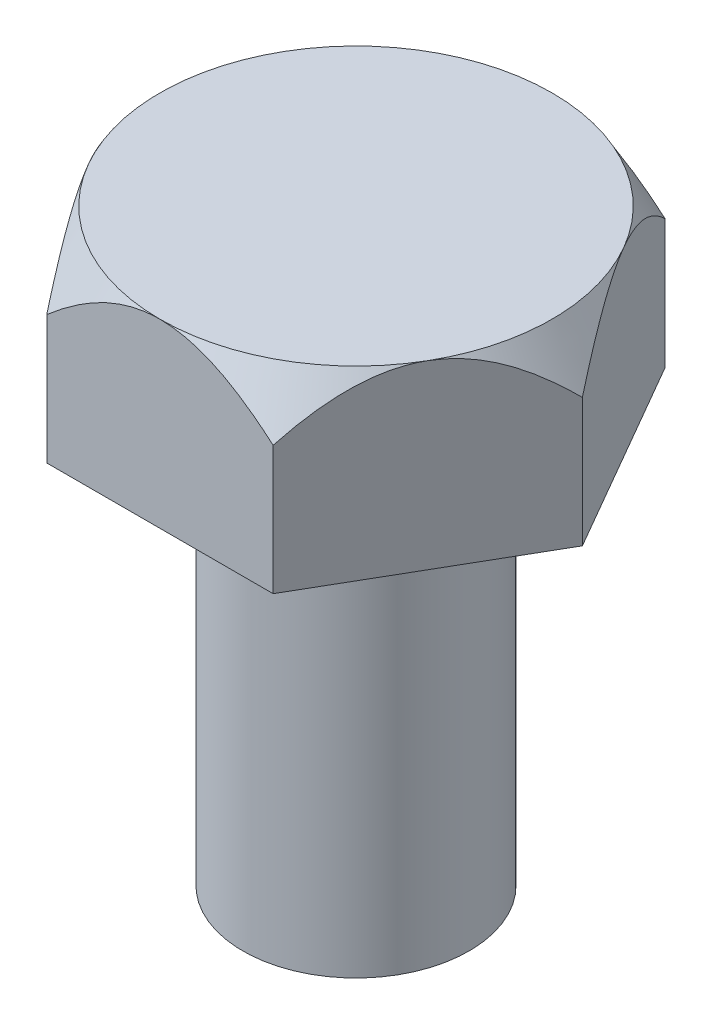
ISO-10303-21;
HEADER;
FILE_DESCRIPTION(('STEP AP214'),'2;1');
FILE_NAME('part.step','',(''),(''),'','','');
FILE_SCHEMA(('AUTOMOTIVE_DESIGN { 1 0 10303 214 1 1 1 1 }'));
ENDSEC;
DATA;
#1=APPLICATION_CONTEXT('core data for automotive mechanical design processes');
#2=APPLICATION_PROTOCOL_DEFINITION('international standard','automotive_design',2000,#1);
#3=PRODUCT_CONTEXT('',#1,'mechanical');
#4=PRODUCT('Part','Part','',(#3));
#5=PRODUCT_RELATED_PRODUCT_CATEGORY('part','',(#4));
#6=PRODUCT_DEFINITION_FORMATION('','',#4);
#7=PRODUCT_DEFINITION_CONTEXT('part definition',#1,'design');
#8=PRODUCT_DEFINITION('design','',#6,#7);
#9=PRODUCT_DEFINITION_SHAPE('','',#8);
#10=(LENGTH_UNIT() NAMED_UNIT(*) SI_UNIT(.MILLI.,.METRE.));
#11=(NAMED_UNIT(*) PLANE_ANGLE_UNIT() SI_UNIT($,.RADIAN.));
#12=(NAMED_UNIT(*) SI_UNIT($,.STERADIAN.) SOLID_ANGLE_UNIT());
#13=UNCERTAINTY_MEASURE_WITH_UNIT(LENGTH_MEASURE(1.E-05),#10,'distance_accuracy_value','');
#14=(GEOMETRIC_REPRESENTATION_CONTEXT(3) GLOBAL_UNCERTAINTY_ASSIGNED_CONTEXT((#13)) GLOBAL_UNIT_ASSIGNED_CONTEXT((#10,
#11,#12)) REPRESENTATION_CONTEXT('',''));
#15=CARTESIAN_POINT('',(0.,0.,0.));
#16=DIRECTION('',(0.,0.,1.));
#17=DIRECTION('',(1.,0.,0.));
#18=AXIS2_PLACEMENT_3D('',#15,#16,#17);
#19=CARTESIAN_POINT('',(2.50000000000005,2.,4.33012701892216));
#20=DIRECTION('',(-0.866025403784441,0.,-0.499999999999995));
#21=DIRECTION('',(-0.499999999999995,0.,0.866025403784442));
#22=AXIS2_PLACEMENT_3D('',#19,#20,#21);
#23=PLANE('',#22);
#24=CARTESIAN_POINT('',(2.49988452994621,0.839545955227598,4.33032701892216));
#25=CARTESIAN_POINT('',(2.52603245800554,0.884833991447394,4.28503747901075));
#26=CARTESIAN_POINT('',(2.55244128791382,0.929518035923133,4.23929604384116));
#27=CARTESIAN_POINT('',(2.60583817838497,1.01750976912944,4.14680991657893));
#28=CARTESIAN_POINT('',(2.63282640201025,1.06081706165426,4.10006494205393));
#29=CARTESIAN_POINT('',(2.71500179884512,1.18881585056256,3.95773297960379));
#30=CARTESIAN_POINT('',(2.77113436738581,1.27111911679774,3.86050851893198));
#31=CARTESIAN_POINT('',(2.88776924238884,1.42932238274939,3.65849098949228));
#32=CARTESIAN_POINT('',(2.94834697835078,1.50500200033683,3.5535672729987));
#33=CARTESIAN_POINT('',(3.07278408923163,1.64429961580708,3.33803587460598));
#34=CARTESIAN_POINT('',(3.13663580046347,1.70794428122144,3.22744146660223));
#35=CARTESIAN_POINT('',(3.2378366675211,1.79393750545759,3.05215642308838));
#36=CARTESIAN_POINT('',(3.27400113565673,1.82188687918375,2.98951772684876));
#37=CARTESIAN_POINT('',(3.34727729424076,1.87236847470195,2.86259969719775));
#38=CARTESIAN_POINT('',(3.38438905537677,1.89490029091747,2.79832024135182));
#39=CARTESIAN_POINT('',(3.45911696425962,1.93368543760243,2.66888770642335));
#40=CARTESIAN_POINT('',(3.49672679341896,1.9499870584244,2.60374557145538));
#41=CARTESIAN_POINT('',(3.57251251722487,1.97597375980844,2.47248084733516));
#42=CARTESIAN_POINT('',(3.6106883045947,1.98566007831629,2.40635844399167));
#43=CARTESIAN_POINT('',(3.68767936258864,1.99808653406365,2.27300601981768));
#44=CARTESIAN_POINT('',(3.72649728421043,2.00076182897186,2.20577140732451));
#45=CARTESIAN_POINT('',(3.80408749242931,1.99886400426914,2.07138122451956));
#46=CARTESIAN_POINT('',(3.84285977918336,1.99429090966185,2.00422565393592));
#47=CARTESIAN_POINT('',(3.92011612559996,1.97807202204519,1.87041373673523));
#48=CARTESIAN_POINT('',(3.9585993739899,1.96641085271009,1.80375879528356));
#49=CARTESIAN_POINT('',(4.03492590542164,1.93647663009405,1.67155736487828));
#50=CARTESIAN_POINT('',(4.07276878876885,1.91819959598438,1.60601156821601));
#51=CARTESIAN_POINT('',(4.20657897982356,1.84210445780605,1.37424551873874));
#52=CARTESIAN_POINT('',(4.30021121617737,1.76734971383784,1.21206972814764));
#53=CARTESIAN_POINT('',(4.43543249725157,1.63456913855986,0.977859599062575));
#54=CARTESIAN_POINT('',(4.47974586319208,1.58671256690894,0.901106597799212));
#55=CARTESIAN_POINT('',(4.56673669386177,1.485346588253,0.750434059286692));
#56=CARTESIAN_POINT('',(4.60941442616695,1.4318381112785,0.676514058582298));
#57=CARTESIAN_POINT('',(4.7127668261096,1.29425164004733,0.497502450797452));
#58=CARTESIAN_POINT('',(4.77256183449973,1.20754661318338,0.393934458226729));
#59=CARTESIAN_POINT('',(4.85978832952453,1.07256834333777,0.242853737077619));
#60=CARTESIAN_POINT('',(4.88829841155851,1.02702662505186,0.193472826466821));
#61=CARTESIAN_POINT('',(4.94467395600481,0.934395945980258,0.0958275191814639));
#62=CARTESIAN_POINT('',(4.97253955043799,0.887307306945606,0.0475628938400857));
#63=CARTESIAN_POINT('',(5.00011547005384,0.839545955227599,-0.000200000000000099));
#64=B_SPLINE_CURVE_WITH_KNOTS('',3,(#24,#25,#26,#27,#28,#29,#30,#31,#32,#33,#34,#35,#36,#37,#38,
#39,#40,#41,#42,#43,#44,#45,#46,#47,#48,#49,#50,#51,#52,#53,#54,#55,#56,#57,#58,#59,#60,#61,#62,
#63),.UNSPECIFIED.,.F.,.F.,(4,2,2,2,2,2,2,2,2,2,2,2,2,2,2,2,2,2,2,4),(0.,0.207530396012229,
0.41511998480407,0.832413361514788,1.26048832134564,1.68760332572676,1.92005107232724,
2.15251621533175,2.38314109470961,2.6137228045741,2.84642967265257,3.0791357380002,
3.31234842869416,3.54570167958106,4.14661318376483,4.44867935464676,4.75069589723914,
5.19343142055808,5.41233685043555,5.63119703392207),.UNSPECIFIED.);
#65=CARTESIAN_POINT('',(2.50000000000005,0.839745962155642,4.33012701892216));
#66=VERTEX_POINT('',#65);
#67=CARTESIAN_POINT('',(3.75000000000002,2.,2.16506350946108));
#68=VERTEX_POINT('',#67);
#69=EDGE_CURVE('E130',#66,#68,#64,.T.);
#70=ORIENTED_EDGE('',*,*,#69,.F.);
#71=DIRECTION('',(0.,-1.,0.));
#72=VECTOR('',#71,1.);
#73=CARTESIAN_POINT('',(2.50000000000005,2.,4.33012701892216));
#74=LINE('',#73,#72);
#75=CARTESIAN_POINT('',(2.50000000000005,-2.,4.33012701892216));
#76=VERTEX_POINT('',#75);
#77=EDGE_CURVE('E79',#66,#76,#74,.T.);
#78=ORIENTED_EDGE('',*,*,#77,.T.);
#79=DIRECTION('',(0.499999999999995,0.,-0.866025403784441));
#80=VECTOR('',#79,1.);
#81=CARTESIAN_POINT('',(2.50000000000005,-2.,4.33012701892216));
#82=LINE('',#81,#80);
#83=CARTESIAN_POINT('',(5.,-2.,0.));
#84=VERTEX_POINT('',#83);
#85=EDGE_CURVE('E137',#76,#84,#82,.T.);
#86=ORIENTED_EDGE('',*,*,#85,.T.);
#87=DIRECTION('',(0.,-1.,0.));
#88=VECTOR('',#87,1.);
#89=CARTESIAN_POINT('',(5.,2.,0.));
#90=LINE('',#89,#88);
#91=CARTESIAN_POINT('',(5.,0.839745962155641,0.));
#92=VERTEX_POINT('',#91);
#93=EDGE_CURVE('E153',#92,#84,#90,.T.);
#94=ORIENTED_EDGE('',*,*,#93,.F.);
#95=EDGE_CURVE('E138',#68,#92,#64,.T.);
#96=ORIENTED_EDGE('',*,*,#95,.F.);
#97=EDGE_LOOP('',(#70,#78,#86,#94,#96));
#98=FACE_BOUND('',#97,.T.);
#99=ADVANCED_FACE('F55',(#98),#23,.F.);
#100=CARTESIAN_POINT('',(5.,2.,0.));
#101=DIRECTION('',(-0.866025403784438,0.,0.500000000000001));
#102=DIRECTION('',(0.500000000000001,0.,0.866025403784438));
#103=AXIS2_PLACEMENT_3D('',#100,#101,#102);
#104=PLANE('',#103);
#105=CARTESIAN_POINT('',(5.00011547005384,0.839545955227598,0.000200000000000032));
#106=CARTESIAN_POINT('',(4.97396754199451,0.884833991447395,-0.0450895399114115));
#107=CARTESIAN_POINT('',(4.94755871208623,0.929518035923133,-0.0908309750810041));
#108=CARTESIAN_POINT('',(4.89416182161507,1.01750976912944,-0.183317102343229));
#109=CARTESIAN_POINT('',(4.8671735979898,1.06081706165426,-0.230062076868234));
#110=CARTESIAN_POINT('',(4.78499820115492,1.18881585056256,-0.372394039318373));
#111=CARTESIAN_POINT('',(4.72886563261424,1.27111911679774,-0.469618499990178));
#112=CARTESIAN_POINT('',(4.61223075761121,1.42932238274939,-0.671636029429878));
#113=CARTESIAN_POINT('',(4.55165302164927,1.50500200033683,-0.776559745923452));
#114=CARTESIAN_POINT('',(4.42721591076841,1.64429961580709,-0.992091144316173));
#115=CARTESIAN_POINT('',(4.36336419953658,1.70794428122145,-1.10268555231992));
#116=CARTESIAN_POINT('',(4.26216333247894,1.7939375054576,-1.27797059583377));
#117=CARTESIAN_POINT('',(4.22599886434331,1.82188687918376,-1.34060929207339));
#118=CARTESIAN_POINT('',(4.15272270575929,1.87236847470197,-1.4675273217244));
#119=CARTESIAN_POINT('',(4.11561094462327,1.89490029091748,-1.53180677757033));
#120=CARTESIAN_POINT('',(4.04088303574043,1.93368543760245,-1.6612393124988));
#121=CARTESIAN_POINT('',(4.00327320658108,1.94998705842442,-1.72638144746677));
#122=CARTESIAN_POINT('',(3.92748748277517,1.97597375980847,-1.85764617158699));
#123=CARTESIAN_POINT('',(3.88931169540534,1.98566007831632,-1.92376857493048));
#124=CARTESIAN_POINT('',(3.8123206374114,1.99808653406368,-2.05712099910447));
#125=CARTESIAN_POINT('',(3.77350271578961,2.00076182897189,-2.12435561159764));
#126=CARTESIAN_POINT('',(3.69591250757073,1.99886400426917,-2.25874579440259));
#127=CARTESIAN_POINT('',(3.65714022081668,1.99429090966188,-2.32590136498623));
#128=CARTESIAN_POINT('',(3.57988387440008,1.97807202204523,-2.45971328218692));
#129=CARTESIAN_POINT('',(3.54140062601014,1.96641085271012,-2.52636822363859));
#130=CARTESIAN_POINT('',(3.4650740945784,1.93647663009408,-2.65856965404387));
#131=CARTESIAN_POINT('',(3.42723121123119,1.91819959598441,-2.72411545070614));
#132=CARTESIAN_POINT('',(3.29342102017648,1.84210445780609,-2.9558815001834));
#133=CARTESIAN_POINT('',(3.19978878382266,1.76734971383789,-3.1180572907745));
#134=CARTESIAN_POINT('',(3.06456750274847,1.63456913855991,-3.35226741985956));
#135=CARTESIAN_POINT('',(3.02025413680795,1.58671256690899,-3.42902042112292));
#136=CARTESIAN_POINT('',(2.93326330613827,1.48534658825306,-3.57969295963544));
#137=CARTESIAN_POINT('',(2.89058557383309,1.43183811127856,-3.65361296033983));
#138=CARTESIAN_POINT('',(2.78723317389043,1.29425164004739,-3.83262456812469));
#139=CARTESIAN_POINT('',(2.72743816550029,1.20754661318342,-3.93619256069542));
#140=CARTESIAN_POINT('',(2.64021167047548,1.07256834333779,-4.08727328184455));
#141=CARTESIAN_POINT('',(2.6117015884415,1.02702662505189,-4.13665419245536));
#142=CARTESIAN_POINT('',(2.55532604399519,0.934395945980272,-4.23429949974072));
#143=CARTESIAN_POINT('',(2.527460449562,0.887307306945614,-4.28256412508211));
#144=CARTESIAN_POINT('',(2.49988452994615,0.839545955227599,-4.3303270189222));
#145=B_SPLINE_CURVE_WITH_KNOTS('',3,(#105,#106,#107,#108,#109,#110,#111,#112,#113,#114,#115,
#116,#117,#118,#119,#120,#121,#122,#123,#124,#125,#126,#127,#128,#129,#130,#131,#132,#133,#134,
#135,#136,#137,#138,#139,#140,#141,#142,#143,#144),.UNSPECIFIED.,.F.,.F.,(4,2,2,2,2,2,2,2,2,2,2,
2,2,2,2,2,2,2,2,4),(0.,0.207530396012229,0.41511998480407,0.832413361514788,1.26048832134564,
1.68760332572676,1.92005107232724,2.15251621533175,2.38314109470961,2.6137228045741,
2.84642967265257,3.0791357380002,3.31234842869416,3.54570167958106,4.14661318376482,
4.44867935464674,4.75069589723911,5.19343142055811,5.4123368504356,5.63119703392216),.UNSPECIFIED.);
#146=CARTESIAN_POINT('',(3.75000000000001,2.,-2.16506350946111));
#147=VERTEX_POINT('',#146);
#148=EDGE_CURVE('E144',#92,#147,#145,.T.);
#149=ORIENTED_EDGE('',*,*,#148,.F.);
#150=ORIENTED_EDGE('',*,*,#93,.T.);
#151=DIRECTION('',(-0.500000000000001,0.,-0.866025403784438));
#152=VECTOR('',#151,1.);
#153=CARTESIAN_POINT('',(5.,-2.,0.));
#154=LINE('',#153,#152);
#155=CARTESIAN_POINT('',(2.49999999999999,-2.,-4.3301270189222));
#156=VERTEX_POINT('',#155);
#157=EDGE_CURVE('E277',#84,#156,#154,.T.);
#158=ORIENTED_EDGE('',*,*,#157,.T.);
#159=DIRECTION('',(0.,-1.,0.));
#160=VECTOR('',#159,1.);
#161=CARTESIAN_POINT('',(2.49999999999999,2.,-4.3301270189222));
#162=LINE('',#161,#160);
#163=CARTESIAN_POINT('',(2.5,0.839745962155638,-4.3301270189222));
#164=VERTEX_POINT('',#163);
#165=EDGE_CURVE('E225',#164,#156,#162,.T.);
#166=ORIENTED_EDGE('',*,*,#165,.F.);
#167=EDGE_CURVE('E154',#147,#164,#145,.T.);
#168=ORIENTED_EDGE('',*,*,#167,.F.);
#169=EDGE_LOOP('',(#149,#150,#158,#166,#168));
#170=FACE_BOUND('',#169,.T.);
#171=ADVANCED_FACE('F213',(#170),#104,.F.);
#172=CARTESIAN_POINT('',(2.49999999999999,2.,-4.3301270189222));
#173=DIRECTION('',(0.,0.,1.));
#174=DIRECTION('',(1.,0.,0.));
#175=AXIS2_PLACEMENT_3D('',#172,#173,#174);
#176=PLANE('',#175);
#177=CARTESIAN_POINT('',(8.90332423743285,-7.64810623452562,-4.33012701892222));
#178=CARTESIAN_POINT('',(8.69602215610967,-7.32527001934207,-4.33012701892222));
#179=CARTESIAN_POINT('',(8.48778754848835,-7.00302641783207,-4.33012701892222));
#180=CARTESIAN_POINT('',(8.0688827579577,-6.36006976866711,-4.33012701892222));
#181=CARTESIAN_POINT('',(7.85821227360527,-6.03935691753533,-4.33012701892222));
#182=CARTESIAN_POINT('',(7.43268022903962,-5.39802438573094,-4.33012701892221));
#183=CARTESIAN_POINT('',(7.21780139733113,-5.07741614445935,-4.33012701892221));
#184=CARTESIAN_POINT('',(6.78426967355143,-4.43878947198974,-4.33012701892221));
#185=CARTESIAN_POINT('',(6.56561705788568,-4.12077085360854,-4.33012701892221));
#186=CARTESIAN_POINT('',(6.12336031116201,-3.48807053423377,-4.33012701892221));
#187=CARTESIAN_POINT('',(5.8997549614176,-3.17338968335631,-4.33012701892221));
#188=CARTESIAN_POINT('',(5.44600645755849,-2.54864312918355,-4.33012701892221));
#189=CARTESIAN_POINT('',(5.21586194798305,-2.23857840333564,-4.33012701892221));
#190=CARTESIAN_POINT('',(4.86429634831442,-1.7790355728254,-4.33012701892221));
#191=CARTESIAN_POINT('',(4.74622453357954,-1.62699565661331,-4.33012701892221));
#192=CARTESIAN_POINT('',(4.50743458246693,-1.32501156615533,-4.3301270189222));
#193=CARTESIAN_POINT('',(4.38671654439399,-1.17506731439513,-4.3301270189222));
#194=CARTESIAN_POINT('',(4.14215079587613,-0.877835913393945,-4.3301270189222));
#195=CARTESIAN_POINT('',(4.01830420593334,-0.730547844336402,-4.3301270189222));
#196=CARTESIAN_POINT('',(3.76677673873791,-0.439292411316175,-4.3301270189222));
#197=CARTESIAN_POINT('',(3.63909627827801,-0.295324689374677,-4.3301270189222));
#198=CARTESIAN_POINT('',(3.41992450053206,-0.0563227011007293,-4.3301270189222));
#199=CARTESIAN_POINT('',(3.32968425515188,0.0398578091695814,-4.3301270189222));
#200=CARTESIAN_POINT('',(3.14662429015355,0.229746650116585,-4.3301270189222));
#201=CARTESIAN_POINT('',(3.05380448884308,0.323454902315363,-4.3301270189222));
#202=CARTESIAN_POINT('',(2.86491271155662,0.508065807019591,-4.3301270189222));
#203=CARTESIAN_POINT('',(2.76883262753033,0.598960196655615,-4.3301270189222));
#204=CARTESIAN_POINT('',(2.5731557771072,0.776893856935021,-4.3301270189222));
#205=CARTESIAN_POINT('',(2.47355914462662,0.863933274098476,-4.3301270189222));
#206=CARTESIAN_POINT('',(2.26912559219564,1.03404426062997,-4.3301270189222));
#207=CARTESIAN_POINT('',(2.16424279084733,1.1170610909807,-4.3301270189222));
#208=CARTESIAN_POINT('',(1.94955973509856,1.27661139120661,-4.3301270189222));
#209=CARTESIAN_POINT('',(1.83975783380945,1.35314266457758,-4.3301270189222));
#210=CARTESIAN_POINT('',(1.61498981398344,1.4973730324289,-4.3301270189222));
#211=CARTESIAN_POINT('',(1.50004414874248,1.56510354028243,-4.3301270189222));
#212=CARTESIAN_POINT('',(1.26429732718789,1.68927003679829,-4.3301270189222));
#213=CARTESIAN_POINT('',(1.14350235511086,1.74571764396105,-4.33012701892219));
#214=CARTESIAN_POINT('',(0.877736914834077,1.85118579239567,-4.33012701892219));
#215=CARTESIAN_POINT('',(0.731813031876828,1.8979158561267,-4.33012701892219));
#216=CARTESIAN_POINT('',(0.50879562231915,1.94948660262603,-4.33012701892219));
#217=CARTESIAN_POINT('',(0.433791091214795,1.96358799963745,-4.33012701892219));
#218=CARTESIAN_POINT('',(0.282844706462079,1.98514293223037,-4.33012701892219));
#219=CARTESIAN_POINT('',(0.206903285609034,1.99259942882887,-4.33012701892219));
#220=CARTESIAN_POINT('',(0.0542363291986173,2.00058275018493,-4.33012701892219));
#221=CARTESIAN_POINT('',(-0.0224912216776322,2.00107122471972,-4.33012701892219));
#222=CARTESIAN_POINT('',(-0.175662966974078,1.99500278081353,-4.33012701892219));
#223=CARTESIAN_POINT('',(-0.252107163746632,1.98844592099375,-4.33012701892219));
#224=CARTESIAN_POINT('',(-0.404137885217594,1.96854997037407,-4.33012701892219));
#225=CARTESIAN_POINT('',(-0.479723997606456,1.95520774941889,-4.33012701892219));
#226=CARTESIAN_POINT('',(-0.629532510610587,1.9222478233323,-4.33012701892219));
#227=CARTESIAN_POINT('',(-0.703754069173115,1.90262637228509,-4.33012701892219));
#228=CARTESIAN_POINT('',(-0.975074195234651,1.81959398420567,-4.33012701892219));
#229=CARTESIAN_POINT('',(-1.16687648964967,1.73839151614666,-4.33012701892219));
#230=CARTESIAN_POINT('',(-1.44339720542346,1.59578476767964,-4.33012701892219));
#231=CARTESIAN_POINT('',(-1.53389708121863,1.54464393722334,-4.33012701892219));
#232=CARTESIAN_POINT('',(-1.71147760366545,1.43669911299648,-4.33012701892219));
#233=CARTESIAN_POINT('',(-1.79855891194624,1.37989622266718,-4.33012701892218));
#234=CARTESIAN_POINT('',(-2.00784977677154,1.23527945155505,-4.33012701892218));
#235=CARTESIAN_POINT('',(-2.12832141031004,1.14497219985136,-4.33012701892218));
#236=CARTESIAN_POINT('',(-2.36366341682798,0.957282889617457,-4.33012701892218));
#237=CARTESIAN_POINT('',(-2.47853062740488,0.859896912206858,-4.33012701892218));
#238=CARTESIAN_POINT('',(-2.70374944201168,0.659597372567355,-4.33012701892218));
#239=CARTESIAN_POINT('',(-2.8140908431803,0.556672413602481,-4.33012701892218));
#240=CARTESIAN_POINT('',(-3.03075166093091,0.346738082279572,-4.33012701892218));
#241=CARTESIAN_POINT('',(-3.1370718710835,0.239729524270955,-4.33012701892218));
#242=CARTESIAN_POINT('',(-3.34746045458853,0.0213410485382503,-4.33012701892218));
#243=CARTESIAN_POINT('',(-3.45149313082608,-0.0900731267100149,-4.33012701892218));
#244=CARTESIAN_POINT('',(-3.65666237297262,-0.315534928670349,-4.33012701892218));
#245=CARTESIAN_POINT('',(-3.75779882566589,-0.429582658016249,-4.33012701892218));
#246=CARTESIAN_POINT('',(-4.05727125068568,-0.774601208987092,-4.33012701892218));
#247=CARTESIAN_POINT('',(-4.25195088145701,-1.00874422150379,-4.33012701892218));
#248=CARTESIAN_POINT('',(-4.65231964958637,-1.50538264323355,-4.33012701892218));
#249=CARTESIAN_POINT('',(-4.85728888481228,-1.76845289776179,-4.33012701892218));
#250=CARTESIAN_POINT('',(-5.26083545020631,-2.29947548883489,-4.33012701892217));
#251=CARTESIAN_POINT('',(-5.459412089146,-2.56742834846051,-4.33012701892217));
#252=CARTESIAN_POINT('',(-5.85185367067019,-3.10713749085106,-4.33012701892217));
#253=CARTESIAN_POINT('',(-6.04571397349571,-3.37889713495899,-4.33012701892217));
#254=CARTESIAN_POINT('',(-6.42960518978656,-3.92510949257388,-4.33012701892217));
#255=CARTESIAN_POINT('',(-6.61963602907553,-4.19956225809352,-4.33012701892217));
#256=CARTESIAN_POINT('',(-6.98723935100029,-4.73681354264919,-4.33012701892217));
#257=CARTESIAN_POINT('',(-7.16496046705592,-4.99951055739544,-4.33012701892217));
#258=CARTESIAN_POINT('',(-7.51814471603265,-5.52642267841676,-4.33012701892217));
#259=CARTESIAN_POINT('',(-7.69360781219477,-5.79063780930467,-4.33012701892217));
#260=CARTESIAN_POINT('',(-8.04234452657371,-6.31982004837233,-4.33012701892217));
#261=CARTESIAN_POINT('',(-8.21562154062941,-6.58478492138285,-4.33012701892217));
#262=CARTESIAN_POINT('',(-8.56058927498402,-7.1157310980349,-4.33012701892216));
#263=CARTESIAN_POINT('',(-8.73228005650843,-7.38171236188081,-4.33012701892216));
#264=CARTESIAN_POINT('',(-8.90332423743287,-7.64810623452562,-4.33012701892216));
#265=B_SPLINE_CURVE_WITH_KNOTS('',3,(#177,#178,#179,#180,#181,#182,#183,#184,#185,#186,#187,
#188,#189,#190,#191,#192,#193,#194,#195,#196,#197,#198,#199,#200,#201,#202,#203,#204,#205,#206,
#207,#208,#209,#210,#211,#212,#213,#214,#215,#216,#217,#218,#219,#220,#221,#222,#223,#224,#225,
#226,#227,#228,#229,#230,#231,#232,#233,#234,#235,#236,#237,#238,#239,#240,#241,#242,#243,#244,
#245,#246,#247,#248,#249,#250,#251,#252,#253,#254,#255,#256,#257,#258,#259,#260,#261,#262,#263,
#264),.UNSPECIFIED.,.F.,.F.,(4,2,2,2,2,2,2,2,2,2,2,2,2,2,2,2,2,2,2,2,2,2,2,2,2,2,2,2,2,2,2,2,2,
2,2,2,2,2,2,2,2,2,2,4),(0.,1.15099554710912,2.30213508931981,3.45998443544268,4.61774933342322,
5.77580235129399,6.93409719144526,7.51158108722218,8.0890435662333,8.66630207791001,
9.24349805950522,9.63911815223681,10.0347507882277,10.4314521839082,10.8281384887713,
11.2292261141658,11.6304490400188,12.0301980189636,12.4295332137175,12.8872195799682,
13.11592509104,13.3445286382027,13.5743898787876,13.8042492068104,14.0342146675653,
14.2643175722603,14.8850381773704,15.1967984032115,15.5084979905178,15.9598230877643,
16.4113999763068,16.8639444493615,17.3163991430327,17.7736379504298,18.2308946073313,
19.1441836927137,20.1445445707711,21.1450132565137,22.1464293265599,23.1478647753348,
24.0993501732842,25.0508510412016,26.0006249648798,26.9503620746744),.UNSPECIFIED.);
#266=CARTESIAN_POINT('',(0.,2.,-4.33012701892221));
#267=VERTEX_POINT('',#266);
#268=EDGE_CURVE('E207',#164,#267,#265,.T.);
#269=ORIENTED_EDGE('',*,*,#268,.F.);
#270=ORIENTED_EDGE('',*,*,#165,.T.);
#271=DIRECTION('',(-1.,0.,0.));
#272=VECTOR('',#271,1.);
#273=CARTESIAN_POINT('',(2.49999999999999,-2.,-4.3301270189222));
#274=LINE('',#273,#272);
#275=CARTESIAN_POINT('',(-2.50000000000002,-2.,-4.33012701892218));
#276=VERTEX_POINT('',#275);
#277=EDGE_CURVE('E243',#156,#276,#274,.T.);
#278=ORIENTED_EDGE('',*,*,#277,.T.);
#279=DIRECTION('',(0.,-1.,0.));
#280=VECTOR('',#279,1.);
#281=CARTESIAN_POINT('',(-2.50000000000002,2.,-4.33012701892218));
#282=LINE('',#281,#280);
#283=CARTESIAN_POINT('',(-2.50000000000002,0.83974596215564,-4.33012701892218));
#284=VERTEX_POINT('',#283);
#285=EDGE_CURVE('E241',#284,#276,#282,.T.);
#286=ORIENTED_EDGE('',*,*,#285,.F.);
#287=EDGE_CURVE('E201',#267,#284,#265,.T.);
#288=ORIENTED_EDGE('',*,*,#287,.F.);
#289=EDGE_LOOP('',(#269,#270,#278,#286,#288));
#290=FACE_BOUND('',#289,.T.);
#291=ADVANCED_FACE('F209',(#290),#176,.F.);
#292=CARTESIAN_POINT('',(-2.50000000000002,2.,-4.33012701892218));
#293=DIRECTION('',(0.866025403784442,0.,0.499999999999995));
#294=DIRECTION('',(0.499999999999995,0.,-0.866025403784442));
#295=AXIS2_PLACEMENT_3D('',#292,#293,#294);
#296=PLANE('',#295);
#297=CARTESIAN_POINT('',(-2.49988452994618,0.839545955227596,-4.33032701892218));
#298=CARTESIAN_POINT('',(-2.52603245800551,0.884833991447393,-4.28503747901077));
#299=CARTESIAN_POINT('',(-2.55244128791379,0.929518035923131,-4.23929604384118));
#300=CARTESIAN_POINT('',(-2.60583817838494,1.01750976912944,-4.14680991657895));
#301=CARTESIAN_POINT('',(-2.63282640201022,1.06081706165426,-4.10006494205395));
#302=CARTESIAN_POINT('',(-2.71500179884509,1.18881585056256,-3.95773297960381));
#303=CARTESIAN_POINT('',(-2.77113436738577,1.27111911679774,-3.860508518932));
#304=CARTESIAN_POINT('',(-2.88776924238881,1.42932238274939,-3.6584909894923));
#305=CARTESIAN_POINT('',(-2.94834697835075,1.50500200033683,-3.55356727299873));
#306=CARTESIAN_POINT('',(-3.0727840892316,1.64429961580709,-3.33803587460601));
#307=CARTESIAN_POINT('',(-3.13663580046343,1.70794428122145,-3.22744146660225));
#308=CARTESIAN_POINT('',(-3.23783666752107,1.7939375054576,-3.05215642308841));
#309=CARTESIAN_POINT('',(-3.2740011356567,1.82188687918376,-2.98951772684878));
#310=CARTESIAN_POINT('',(-3.34727729424072,1.87236847470197,-2.86259969719778));
#311=CARTESIAN_POINT('',(-3.38438905537673,1.89490029091748,-2.79832024135184));
#312=CARTESIAN_POINT('',(-3.45911696425958,1.93368543760245,-2.66888770642337));
#313=CARTESIAN_POINT('',(-3.49672679341892,1.94998705842442,-2.60374557145541));
#314=CARTESIAN_POINT('',(-3.57251251722483,1.97597375980847,-2.47248084733519));
#315=CARTESIAN_POINT('',(-3.61068830459466,1.98566007831631,-2.40635844399169));
#316=CARTESIAN_POINT('',(-3.6876793625886,1.99808653406368,-2.27300601981771));
#317=CARTESIAN_POINT('',(-3.72649728421039,2.00076182897189,-2.20577140732454));
#318=CARTESIAN_POINT('',(-3.80408749242927,1.99886400426918,-2.07138122451959));
#319=CARTESIAN_POINT('',(-3.84285977918332,1.99429090966188,-2.00422565393595));
#320=CARTESIAN_POINT('',(-3.92011612559992,1.97807202204523,-1.87041373673525));
#321=CARTESIAN_POINT('',(-3.95859937398986,1.96641085271013,-1.80375879528359));
#322=CARTESIAN_POINT('',(-4.0349259054216,1.93647663009408,-1.6715573648783));
#323=CARTESIAN_POINT('',(-4.07276878876881,1.91819959598442,-1.60601156821603));
#324=CARTESIAN_POINT('',(-4.20657897982352,1.84210445780609,-1.37424551873877));
#325=CARTESIAN_POINT('',(-4.30021121617733,1.76734971383789,-1.21206972814767));
#326=CARTESIAN_POINT('',(-4.43543249725153,1.63456913855991,-0.97785959906261));
#327=CARTESIAN_POINT('',(-4.47974586319204,1.586712566909,-0.901106597799249));
#328=CARTESIAN_POINT('',(-4.56673669386173,1.48534658825306,-0.750434059286731));
#329=CARTESIAN_POINT('',(-4.6094144261669,1.43183811127856,-0.676514058582338));
#330=CARTESIAN_POINT('',(-4.71276682610956,1.29425164004739,-0.497502450797479));
#331=CARTESIAN_POINT('',(-4.7725618344997,1.20754661318343,-0.393934458226742));
#332=CARTESIAN_POINT('',(-4.85978832952451,1.0725683433378,-0.242853737077613));
#333=CARTESIAN_POINT('',(-4.88829841155849,1.02702662505189,-0.193472826466808));
#334=CARTESIAN_POINT('',(-4.9446739560048,0.934395945980271,-0.095827519181439));
#335=CARTESIAN_POINT('',(-4.97253955043799,0.887307306945613,-0.0475628938400552));
#336=CARTESIAN_POINT('',(-5.00011547005384,0.839545955227599,0.000200000000035285));
#337=B_SPLINE_CURVE_WITH_KNOTS('',3,(#297,#298,#299,#300,#301,#302,#303,#304,#305,#306,#307,
#308,#309,#310,#311,#312,#313,#314,#315,#316,#317,#318,#319,#320,#321,#322,#323,#324,#325,#326,
#327,#328,#329,#330,#331,#332,#333,#334,#335,#336),.UNSPECIFIED.,.F.,.F.,(4,2,2,2,2,2,2,2,2,2,2,
2,2,2,2,2,2,2,2,4),(0.,0.207530396012229,0.41511998480407,0.832413361514787,1.26048832134564,
1.68760332572676,1.92005107232724,2.15251621533175,2.38314109470961,2.6137228045741,
2.84642967265257,3.0791357380002,3.31234842869417,3.54570167958106,4.14661318376482,
4.44867935464674,4.75069589723911,5.19343142055811,5.41233685043561,5.63119703392216),.UNSPECIFIED.);
#338=CARTESIAN_POINT('',(-3.75000000000002,2.,-2.16506350946108));
#339=VERTEX_POINT('',#338);
#340=EDGE_CURVE('E208',#284,#339,#337,.T.);
#341=ORIENTED_EDGE('',*,*,#340,.F.);
#342=ORIENTED_EDGE('',*,*,#285,.T.);
#343=DIRECTION('',(-0.499999999999995,0.,0.866025403784442));
#344=VECTOR('',#343,1.);
#345=CARTESIAN_POINT('',(-2.50000000000002,-2.,-4.33012701892218));
#346=LINE('',#345,#344);
#347=CARTESIAN_POINT('',(-5.,-2.,0.));
#348=VERTEX_POINT('',#347);
#349=EDGE_CURVE('E275',#276,#348,#346,.T.);
#350=ORIENTED_EDGE('',*,*,#349,.T.);
#351=DIRECTION('',(0.,-1.,0.));
#352=VECTOR('',#351,1.);
#353=CARTESIAN_POINT('',(-5.,2.,0.));
#354=LINE('',#353,#352);
#355=CARTESIAN_POINT('',(-5.,0.839745962155642,0.));
#356=VERTEX_POINT('',#355);
#357=EDGE_CURVE('E247',#356,#348,#354,.T.);
#358=ORIENTED_EDGE('',*,*,#357,.F.);
#359=EDGE_CURVE('E195',#339,#356,#337,.T.);
#360=ORIENTED_EDGE('',*,*,#359,.F.);
#361=EDGE_LOOP('',(#341,#342,#350,#358,#360));
#362=FACE_BOUND('',#361,.T.);
#363=ADVANCED_FACE('F212',(#362),#296,.F.);
#364=CARTESIAN_POINT('',(-5.,2.,0.));
#365=DIRECTION('',(0.866025403784435,0.,-0.500000000000007));
#366=DIRECTION('',(-0.500000000000007,0.,-0.866025403784435));
#367=AXIS2_PLACEMENT_3D('',#364,#365,#366);
#368=PLANE('',#367);
#369=CARTESIAN_POINT('',(-5.00011547005384,0.8395459552276,-0.000199999999965115));
#370=CARTESIAN_POINT('',(-4.97396754199451,0.884833991447396,0.0450895399114464));
#371=CARTESIAN_POINT('',(-4.94755871208622,0.929518035923135,0.0908309750810388));
#372=CARTESIAN_POINT('',(-4.89416182161507,1.01750976912944,0.183317102343263));
#373=CARTESIAN_POINT('',(-4.8671735979898,1.06081706165427,0.230062076868268));
#374=CARTESIAN_POINT('',(-4.78499820115492,1.18881585056256,0.372394039318406));
#375=CARTESIAN_POINT('',(-4.72886563261424,1.27111911679774,0.469618499990212));
#376=CARTESIAN_POINT('',(-4.6122307576112,1.42932238274939,0.67163602942991));
#377=CARTESIAN_POINT('',(-4.55165302164926,1.50500200033683,0.776559745923483));
#378=CARTESIAN_POINT('',(-4.42721591076841,1.64429961580709,0.992091144316204));
#379=CARTESIAN_POINT('',(-4.36336419953657,1.70794428122145,1.10268555231995));
#380=CARTESIAN_POINT('',(-4.26216333247893,1.79393750545761,1.2779705958338));
#381=CARTESIAN_POINT('',(-4.2259988643433,1.82188687918376,1.34060929207342));
#382=CARTESIAN_POINT('',(-4.15272270575927,1.87236847470197,1.46752732172443));
#383=CARTESIAN_POINT('',(-4.11561094462326,1.89490029091748,1.53180677757036));
#384=CARTESIAN_POINT('',(-4.04088303574041,1.93368543760245,1.66123931249883));
#385=CARTESIAN_POINT('',(-4.00327320658107,1.94998705842443,1.72638144746679));
#386=CARTESIAN_POINT('',(-3.92748748277516,1.97597375980847,1.85764617158701));
#387=CARTESIAN_POINT('',(-3.88931169540533,1.98566007831632,1.92376857493051));
#388=CARTESIAN_POINT('',(-3.81232063741139,1.99808653406368,2.05712099910449));
#389=CARTESIAN_POINT('',(-3.77350271578959,2.00076182897189,2.12435561159766));
#390=CARTESIAN_POINT('',(-3.69591250757071,1.99886400426918,2.25874579440261));
#391=CARTESIAN_POINT('',(-3.65714022081666,1.99429090966188,2.32590136498625));
#392=CARTESIAN_POINT('',(-3.57988387440006,1.97807202204523,2.45971328218694));
#393=CARTESIAN_POINT('',(-3.54140062601012,1.96641085271013,2.52636822363861));
#394=CARTESIAN_POINT('',(-3.46507409457838,1.93647663009408,2.65856965404389));
#395=CARTESIAN_POINT('',(-3.42723121123117,1.91819959598442,2.72411545070616));
#396=CARTESIAN_POINT('',(-3.29342102017646,1.84210445780609,2.95588150018342));
#397=CARTESIAN_POINT('',(-3.19978878382264,1.76734971383789,3.11805729077452));
#398=CARTESIAN_POINT('',(-3.06456750274844,1.63456913855991,3.35226741985958));
#399=CARTESIAN_POINT('',(-3.02025413680793,1.58671256690899,3.42902042112294));
#400=CARTESIAN_POINT('',(-2.93326330613824,1.48534658825306,3.57969295963546));
#401=CARTESIAN_POINT('',(-2.89058557383306,1.43183811127856,3.65361296033985));
#402=CARTESIAN_POINT('',(-2.78723317389041,1.29425164004739,3.83262456812471));
#403=CARTESIAN_POINT('',(-2.72743816550026,1.20754661318342,3.93619256069544));
#404=CARTESIAN_POINT('',(-2.64021167047545,1.07256834333779,4.08727328184457));
#405=CARTESIAN_POINT('',(-2.61170158844147,1.02702662505189,4.13665419245537));
#406=CARTESIAN_POINT('',(-2.55532604399516,0.934395945980272,4.23429949974074));
#407=CARTESIAN_POINT('',(-2.52746044956197,0.887307306945614,4.28256412508213));
#408=CARTESIAN_POINT('',(-2.49988452994612,0.8395459552276,4.33032701892222));
#409=B_SPLINE_CURVE_WITH_KNOTS('',3,(#369,#370,#371,#372,#373,#374,#375,#376,#377,#378,#379,
#380,#381,#382,#383,#384,#385,#386,#387,#388,#389,#390,#391,#392,#393,#394,#395,#396,#397,#398,
#399,#400,#401,#402,#403,#404,#405,#406,#407,#408),.UNSPECIFIED.,.F.,.F.,(4,2,2,2,2,2,2,2,2,2,2,
2,2,2,2,2,2,2,2,4),(0.,0.207530396012229,0.41511998480407,0.832413361514787,1.26048832134564,
1.68760332572676,1.92005107232724,2.15251621533175,2.38314109470961,2.6137228045741,
2.84642967265257,3.0791357380002,3.31234842869416,3.54570167958106,4.14661318376482,
4.44867935464674,4.75069589723911,5.19343142055811,5.41233685043561,5.63119703392216),.UNSPECIFIED.);
#410=CARTESIAN_POINT('',(-3.74999999999999,2.,2.16506350946113));
#411=VERTEX_POINT('',#410);
#412=EDGE_CURVE('E259',#356,#411,#409,.T.);
#413=ORIENTED_EDGE('',*,*,#412,.F.);
#414=ORIENTED_EDGE('',*,*,#357,.T.);
#415=DIRECTION('',(0.500000000000007,0.,0.866025403784434));
#416=VECTOR('',#415,1.);
#417=CARTESIAN_POINT('',(-5.,-2.,0.));
#418=LINE('',#417,#416);
#419=CARTESIAN_POINT('',(-2.49999999999996,-2.,4.33012701892222));
#420=VERTEX_POINT('',#419);
#421=EDGE_CURVE('E271',#348,#420,#418,.T.);
#422=ORIENTED_EDGE('',*,*,#421,.T.);
#423=DIRECTION('',(0.,-1.,0.));
#424=VECTOR('',#423,1.);
#425=CARTESIAN_POINT('',(-2.49999999999996,2.,4.33012701892222));
#426=LINE('',#425,#424);
#427=CARTESIAN_POINT('',(-2.49999999999997,0.839745962155639,4.33012701892222));
#428=VERTEX_POINT('',#427);
#429=EDGE_CURVE('E250',#428,#420,#426,.T.);
#430=ORIENTED_EDGE('',*,*,#429,.F.);
#431=EDGE_CURVE('E188',#411,#428,#409,.T.);
#432=ORIENTED_EDGE('',*,*,#431,.F.);
#433=EDGE_LOOP('',(#413,#414,#422,#430,#432));
#434=FACE_BOUND('',#433,.T.);
#435=ADVANCED_FACE('F258',(#434),#368,.F.);
#436=CARTESIAN_POINT('',(-2.49999999999996,2.,4.33012701892222));
#437=DIRECTION('',(0.,0.,-1.));
#438=DIRECTION('',(-1.,0.,0.));
#439=AXIS2_PLACEMENT_3D('',#436,#437,#438);
#440=PLANE('',#439);
#441=CARTESIAN_POINT('',(-8.90332423743282,-7.64810623452562,4.33012701892228));
#442=CARTESIAN_POINT('',(-8.69602215610964,-7.32527001934206,4.33012701892228));
#443=CARTESIAN_POINT('',(-8.48778754848832,-7.00302641783206,4.33012701892228));
#444=CARTESIAN_POINT('',(-8.06888275795767,-6.36006976866711,4.33012701892227));
#445=CARTESIAN_POINT('',(-7.85821227360524,-6.03935691753533,4.33012701892227));
#446=CARTESIAN_POINT('',(-7.43268022903959,-5.39802438573094,4.33012701892227));
#447=CARTESIAN_POINT('',(-7.21780139733109,-5.07741614445935,4.33012701892227));
#448=CARTESIAN_POINT('',(-6.78426967355139,-4.43878947198974,4.33012701892226));
#449=CARTESIAN_POINT('',(-6.56561705788565,-4.12077085360853,4.33012701892226));
#450=CARTESIAN_POINT('',(-6.12336031116197,-3.48807053423377,4.33012701892225));
#451=CARTESIAN_POINT('',(-5.89975496141757,-3.17338968335631,4.33012701892225));
#452=CARTESIAN_POINT('',(-5.44600645755846,-2.54864312918354,4.33012701892225));
#453=CARTESIAN_POINT('',(-5.21586194798301,-2.23857840333563,4.33012701892224));
#454=CARTESIAN_POINT('',(-4.86429634831438,-1.77903557282539,4.33012701892224));
#455=CARTESIAN_POINT('',(-4.74622453357951,-1.62699565661331,4.33012701892224));
#456=CARTESIAN_POINT('',(-4.5074345824669,-1.32501156615532,4.33012701892224));
#457=CARTESIAN_POINT('',(-4.38671654439395,-1.17506731439513,4.33012701892223));
#458=CARTESIAN_POINT('',(-4.14215079587609,-0.877835913393939,4.33012701892223));
#459=CARTESIAN_POINT('',(-4.01830420593331,-0.730547844336397,4.33012701892223));
#460=CARTESIAN_POINT('',(-3.76677673873787,-0.43929241131617,4.33012701892223));
#461=CARTESIAN_POINT('',(-3.63909627827797,-0.295324689374671,4.33012701892223));
#462=CARTESIAN_POINT('',(-3.41992450053203,-0.0563227011007239,4.33012701892223));
#463=CARTESIAN_POINT('',(-3.32968425515184,0.0398578091695862,4.33012701892222));
#464=CARTESIAN_POINT('',(-3.14662429015351,0.229746650116589,4.33012701892222));
#465=CARTESIAN_POINT('',(-3.05380448884304,0.323454902315367,4.33012701892222));
#466=CARTESIAN_POINT('',(-2.86491271155659,0.508065807019595,4.33012701892222));
#467=CARTESIAN_POINT('',(-2.7688326275303,0.59896019665562,4.33012701892222));
#468=CARTESIAN_POINT('',(-2.57315577710717,0.776893856935026,4.33012701892222));
#469=CARTESIAN_POINT('',(-2.47355914462659,0.86393327409848,4.33012701892221));
#470=CARTESIAN_POINT('',(-2.26912559219561,1.03404426062997,4.33012701892221));
#471=CARTESIAN_POINT('',(-2.1642427908473,1.1170610909807,4.33012701892221));
#472=CARTESIAN_POINT('',(-1.94955973509852,1.27661139120661,4.33012701892221));
#473=CARTESIAN_POINT('',(-1.83975783380942,1.35314266457759,4.33012701892221));
#474=CARTESIAN_POINT('',(-1.6149898139834,1.4973730324289,4.33012701892221));
#475=CARTESIAN_POINT('',(-1.50004414874245,1.56510354028243,4.33012701892221));
#476=CARTESIAN_POINT('',(-1.26429732718786,1.68927003679829,4.3301270189222));
#477=CARTESIAN_POINT('',(-1.14350235511083,1.74571764396106,4.3301270189222));
#478=CARTESIAN_POINT('',(-0.877736914834043,1.85118579239567,4.3301270189222));
#479=CARTESIAN_POINT('',(-0.731813031876794,1.8979158561267,4.3301270189222));
#480=CARTESIAN_POINT('',(-0.508795622319116,1.94948660262603,4.3301270189222));
#481=CARTESIAN_POINT('',(-0.43379109121476,1.96358799963746,4.33012701892219));
#482=CARTESIAN_POINT('',(-0.282844706462044,1.98514293223037,4.33012701892219));
#483=CARTESIAN_POINT('',(-0.206903285609,1.99259942882887,4.33012701892219));
#484=CARTESIAN_POINT('',(-0.0542363291985847,2.00058275018493,4.33012701892219));
#485=CARTESIAN_POINT('',(0.0224912216776643,2.00107122471973,4.33012701892219));
#486=CARTESIAN_POINT('',(0.17566296697411,1.99500278081353,4.33012701892219));
#487=CARTESIAN_POINT('',(0.252107163746663,1.98844592099376,4.33012701892219));
#488=CARTESIAN_POINT('',(0.404137885217626,1.96854997037407,4.33012701892219));
#489=CARTESIAN_POINT('',(0.479723997606488,1.95520774941889,4.33012701892218));
#490=CARTESIAN_POINT('',(0.62953251061062,1.9222478233323,4.33012701892218));
#491=CARTESIAN_POINT('',(0.703754069173148,1.9026263722851,4.33012701892218));
#492=CARTESIAN_POINT('',(0.975074195234684,1.81959398420567,4.33012701892218));
#493=CARTESIAN_POINT('',(1.1668764896497,1.73839151614666,4.33012701892218));
#494=CARTESIAN_POINT('',(1.4433972054235,1.59578476767964,4.33012701892217));
#495=CARTESIAN_POINT('',(1.53389708121867,1.54464393722334,4.33012701892217));
#496=CARTESIAN_POINT('',(1.71147760366549,1.43669911299648,4.33012701892217));
#497=CARTESIAN_POINT('',(1.79855891194627,1.37989622266718,4.33012701892217));
#498=CARTESIAN_POINT('',(2.00784977677157,1.23527945155505,4.33012701892217));
#499=CARTESIAN_POINT('',(2.12832141031007,1.14497219985136,4.33012701892217));
#500=CARTESIAN_POINT('',(2.36366341682801,0.957282889617456,4.33012701892217));
#501=CARTESIAN_POINT('',(2.47853062740491,0.859896912206857,4.33012701892216));
#502=CARTESIAN_POINT('',(2.70374944201171,0.659597372567354,4.33012701892216));
#503=CARTESIAN_POINT('',(2.81409084318033,0.55667241360248,4.33012701892216));
#504=CARTESIAN_POINT('',(3.03075166093094,0.346738082279571,4.33012701892216));
#505=CARTESIAN_POINT('',(3.13707187108353,0.239729524270954,4.33012701892216));
#506=CARTESIAN_POINT('',(3.34746045458857,0.0213410485382492,4.33012701892216));
#507=CARTESIAN_POINT('',(3.45149313082612,-0.0900731267100159,4.33012701892215));
#508=CARTESIAN_POINT('',(3.65666237297266,-0.315534928670351,4.33012701892215));
#509=CARTESIAN_POINT('',(3.75779882566592,-0.429582658016252,4.33012701892215));
#510=CARTESIAN_POINT('',(4.05727125068571,-0.774601208987097,4.33012701892215));
#511=CARTESIAN_POINT('',(4.25195088145705,-1.00874422150379,4.33012701892215));
#512=CARTESIAN_POINT('',(4.65231964958641,-1.50538264323355,4.33012701892214));
#513=CARTESIAN_POINT('',(4.85728888481231,-1.76845289776179,4.33012701892214));
#514=CARTESIAN_POINT('',(5.26083545020635,-2.29947548883489,4.33012701892214));
#515=CARTESIAN_POINT('',(5.45941208914604,-2.56742834846052,4.33012701892213));
#516=CARTESIAN_POINT('',(5.85185367067023,-3.10713749085106,4.33012701892213));
#517=CARTESIAN_POINT('',(6.04571397349575,-3.378897134959,4.33012701892213));
#518=CARTESIAN_POINT('',(6.4296051897866,-3.92510949257388,4.33012701892212));
#519=CARTESIAN_POINT('',(6.61963602907557,-4.19956225809352,4.33012701892212));
#520=CARTESIAN_POINT('',(6.98723935100033,-4.7368135426492,4.33012701892212));
#521=CARTESIAN_POINT('',(7.16496046705596,-4.99951055739545,4.33012701892212));
#522=CARTESIAN_POINT('',(7.51814471603268,-5.52642267841677,4.33012701892211));
#523=CARTESIAN_POINT('',(7.6936078121948,-5.79063780930468,4.33012701892211));
#524=CARTESIAN_POINT('',(8.04234452657375,-6.31982004837233,4.33012701892211));
#525=CARTESIAN_POINT('',(8.21562154062944,-6.58478492138285,4.3301270189221));
#526=CARTESIAN_POINT('',(8.56058927498405,-7.11573109803491,4.3301270189221));
#527=CARTESIAN_POINT('',(8.73228005650846,-7.38171236188081,4.3301270189221));
#528=CARTESIAN_POINT('',(8.9033242374329,-7.64810623452562,4.3301270189221));
#529=B_SPLINE_CURVE_WITH_KNOTS('',3,(#441,#442,#443,#444,#445,#446,#447,#448,#449,#450,#451,
#452,#453,#454,#455,#456,#457,#458,#459,#460,#461,#462,#463,#464,#465,#466,#467,#468,#469,#470,
#471,#472,#473,#474,#475,#476,#477,#478,#479,#480,#481,#482,#483,#484,#485,#486,#487,#488,#489,
#490,#491,#492,#493,#494,#495,#496,#497,#498,#499,#500,#501,#502,#503,#504,#505,#506,#507,#508,
#509,#510,#511,#512,#513,#514,#515,#516,#517,#518,#519,#520,#521,#522,#523,#524,#525,#526,#527,
#528),.UNSPECIFIED.,.F.,.F.,(4,2,2,2,2,2,2,2,2,2,2,2,2,2,2,2,2,2,2,2,2,2,2,2,2,2,2,2,2,2,2,2,2,
2,2,2,2,2,2,2,2,2,2,4),(0.,1.15099554710912,2.30213508931981,3.45998443544268,4.61774933342322,
5.77580235129399,6.93409719144527,7.51158108722219,8.08904356623331,8.66630207791002,
9.24349805950523,9.63911815223682,10.0347507882277,10.4314521839082,10.8281384887713,
11.2292261141658,11.6304490400188,12.0301980189636,12.4295332137175,12.8872195799682,
13.11592509104,13.3445286382027,13.5743898787876,13.8042492068104,14.0342146675653,
14.2643175722603,14.8850381773704,15.1967984032115,15.5084979905178,15.9598230877643,
16.4113999763068,16.8639444493615,17.3163991430327,17.7736379504298,18.2308946073313,
19.1441836927137,20.1445445707711,21.1450132565137,22.1464293265599,23.1478647753348,
24.0993501732842,25.0508510412016,26.0006249648798,26.9503620746744),.UNSPECIFIED.);
#530=CARTESIAN_POINT('',(0.,2.,4.33012701892219));
#531=VERTEX_POINT('',#530);
#532=EDGE_CURVE('E264',#428,#531,#529,.T.);
#533=ORIENTED_EDGE('',*,*,#532,.F.);
#534=ORIENTED_EDGE('',*,*,#429,.T.);
#535=DIRECTION('',(1.,0.,0.));
#536=VECTOR('',#535,1.);
#537=CARTESIAN_POINT('',(-2.49999999999996,-2.,4.33012701892222));
#538=LINE('',#537,#536);
#539=EDGE_CURVE('E268',#420,#76,#538,.T.);
#540=ORIENTED_EDGE('',*,*,#539,.T.);
#541=ORIENTED_EDGE('',*,*,#77,.F.);
#542=EDGE_CURVE('E135',#531,#66,#529,.T.);
#543=ORIENTED_EDGE('',*,*,#542,.F.);
#544=EDGE_LOOP('',(#533,#534,#540,#541,#543));
#545=FACE_BOUND('',#544,.T.);
#546=ADVANCED_FACE('F266',(#545),#440,.F.);
#547=CARTESIAN_POINT('',(0.,-2.,0.));
#548=DIRECTION('',(0.,1.,0.));
#549=DIRECTION('',(0.,0.,1.));
#550=AXIS2_PLACEMENT_3D('',#547,#548,#549);
#551=PLANE('',#550);
#552=CARTESIAN_POINT('',(0.,-2.,0.));
#553=DIRECTION('',(0.,-1.,0.));
#554=DIRECTION('',(0.,0.,-1.));
#555=AXIS2_PLACEMENT_3D('',#552,#553,#554);
#556=CIRCLE('',#555,2.5);
#557=CARTESIAN_POINT('',(0.,-2.,-2.5));
#558=VERTEX_POINT('',#557);
#559=EDGE_CURVE('E13',#558,#558,#556,.T.);
#560=ORIENTED_EDGE('',*,*,#559,.F.);
#561=EDGE_LOOP('',(#560));
#562=FACE_BOUND('',#561,.T.);
#563=ORIENTED_EDGE('',*,*,#85,.F.);
#564=ORIENTED_EDGE('',*,*,#539,.F.);
#565=ORIENTED_EDGE('',*,*,#421,.F.);
#566=ORIENTED_EDGE('',*,*,#349,.F.);
#567=ORIENTED_EDGE('',*,*,#277,.F.);
#568=ORIENTED_EDGE('',*,*,#157,.F.);
#569=EDGE_LOOP('',(#563,#564,#565,#566,#567,#568));
#570=FACE_BOUND('',#569,.T.);
#571=ADVANCED_FACE('F279',(#562,#570),#551,.F.);
#572=CARTESIAN_POINT('',(0.,2.,0.));
#573=DIRECTION('',(0.,-1.,0.));
#574=DIRECTION('',(0.,0.,1.));
#575=AXIS2_PLACEMENT_3D('',#572,#573,#574);
#576=CONICAL_SURFACE('',#575,4.33012701892221,0.5235987755983);
#577=ORIENTED_EDGE('',*,*,#431,.T.);
#578=ORIENTED_EDGE('',*,*,#532,.T.);
#579=CARTESIAN_POINT('',(0.,2.,0.));
#580=DIRECTION('',(0.,1.,0.));
#581=DIRECTION('',(0.,0.,1.));
#582=AXIS2_PLACEMENT_3D('',#579,#580,#581);
#583=CIRCLE('',#582,4.33012701892221);
#584=EDGE_CURVE('E59',#411,#531,#583,.T.);
#585=ORIENTED_EDGE('',*,*,#584,.F.);
#586=EDGE_LOOP('',(#577,#578,#585));
#587=FACE_BOUND('',#586,.T.);
#588=ADVANCED_FACE('F172',(#587),#576,.T.);
#589=ORIENTED_EDGE('',*,*,#359,.T.);
#590=ORIENTED_EDGE('',*,*,#412,.T.);
#591=EDGE_CURVE('E238',#339,#411,#583,.T.);
#592=ORIENTED_EDGE('',*,*,#591,.F.);
#593=EDGE_LOOP('',(#589,#590,#592));
#594=FACE_BOUND('',#593,.T.);
#595=ADVANCED_FACE('F281',(#594),#576,.T.);
#596=ORIENTED_EDGE('',*,*,#287,.T.);
#597=ORIENTED_EDGE('',*,*,#340,.T.);
#598=EDGE_CURVE('E233',#267,#339,#583,.T.);
#599=ORIENTED_EDGE('',*,*,#598,.F.);
#600=EDGE_LOOP('',(#596,#597,#599));
#601=FACE_BOUND('',#600,.T.);
#602=ADVANCED_FACE('F234',(#601),#576,.T.);
#603=ORIENTED_EDGE('',*,*,#167,.T.);
#604=ORIENTED_EDGE('',*,*,#268,.T.);
#605=EDGE_CURVE('E148',#147,#267,#583,.T.);
#606=ORIENTED_EDGE('',*,*,#605,.F.);
#607=EDGE_LOOP('',(#603,#604,#606));
#608=FACE_BOUND('',#607,.T.);
#609=ADVANCED_FACE('F229',(#608),#576,.T.);
#610=ORIENTED_EDGE('',*,*,#95,.T.);
#611=ORIENTED_EDGE('',*,*,#148,.T.);
#612=EDGE_CURVE('E64',#68,#147,#583,.T.);
#613=ORIENTED_EDGE('',*,*,#612,.F.);
#614=EDGE_LOOP('',(#610,#611,#613));
#615=FACE_BOUND('',#614,.T.);
#616=ADVANCED_FACE('F142',(#615),#576,.T.);
#617=ORIENTED_EDGE('',*,*,#69,.T.);
#618=CARTESIAN_POINT('',(0.,2.,0.));
#619=DIRECTION('',(0.,1.,0.));
#620=DIRECTION('',(0.,0.,1.));
#621=AXIS2_PLACEMENT_3D('',#618,#619,#620);
#622=CIRCLE('',#621,4.33012701892221);
#623=EDGE_CURVE('E133',#531,#68,#622,.T.);
#624=ORIENTED_EDGE('',*,*,#623,.F.);
#625=ORIENTED_EDGE('',*,*,#542,.T.);
#626=EDGE_LOOP('',(#617,#624,#625));
#627=FACE_BOUND('',#626,.T.);
#628=ADVANCED_FACE('F132',(#627),#576,.T.);
#629=CARTESIAN_POINT('',(0.,2.,0.));
#630=DIRECTION('',(0.,1.,0.));
#631=DIRECTION('',(0.,0.,1.));
#632=AXIS2_PLACEMENT_3D('',#629,#630,#631);
#633=PLANE('',#632);
#634=ORIENTED_EDGE('',*,*,#584,.T.);
#635=ORIENTED_EDGE('',*,*,#623,.T.);
#636=ORIENTED_EDGE('',*,*,#612,.T.);
#637=ORIENTED_EDGE('',*,*,#605,.T.);
#638=ORIENTED_EDGE('',*,*,#598,.T.);
#639=ORIENTED_EDGE('',*,*,#591,.T.);
#640=EDGE_LOOP('',(#634,#635,#636,#637,#638,#639));
#641=FACE_BOUND('',#640,.T.);
#642=ADVANCED_FACE('F149',(#641),#633,.T.);
#643=CARTESIAN_POINT('',(0.,-11.,0.));
#644=DIRECTION('',(0.,1.,0.));
#645=DIRECTION('',(0.,0.,1.));
#646=AXIS2_PLACEMENT_3D('',#643,#644,#645);
#647=CYLINDRICAL_SURFACE('',#646,2.5);
#648=CARTESIAN_POINT('',(0.,-11.,0.));
#649=DIRECTION('',(0.,-1.,0.));
#650=DIRECTION('',(0.,0.,-1.));
#651=AXIS2_PLACEMENT_3D('',#648,#649,#650);
#652=CIRCLE('',#651,2.5);
#653=CARTESIAN_POINT('',(0.,-11.,-2.5));
#654=VERTEX_POINT('',#653);
#655=EDGE_CURVE('E150',#654,#654,#652,.T.);
#656=ORIENTED_EDGE('',*,*,#655,.F.);
#657=EDGE_LOOP('',(#656));
#658=FACE_BOUND('',#657,.T.);
#659=ORIENTED_EDGE('',*,*,#559,.T.);
#660=EDGE_LOOP('',(#659));
#661=FACE_BOUND('',#660,.T.);
#662=ADVANCED_FACE('F173',(#658,#661),#647,.T.);
#663=CARTESIAN_POINT('',(0.,-11.,0.));
#664=DIRECTION('',(0.,-1.,0.));
#665=DIRECTION('',(0.,0.,-1.));
#666=AXIS2_PLACEMENT_3D('',#663,#664,#665);
#667=PLANE('',#666);
#668=ORIENTED_EDGE('',*,*,#655,.T.);
#669=EDGE_LOOP('',(#668));
#670=FACE_BOUND('',#669,.T.);
#671=ADVANCED_FACE('F363',(#670),#667,.T.);
#672=CLOSED_SHELL('',(#99,#171,#291,#363,#435,#546,#571,#588,#595,#602,#609,#616,#628,#642,#662,#671));
#673=MANIFOLD_SOLID_BREP('B2',#672);
#674=ADVANCED_BREP_SHAPE_REPRESENTATION('',(#18,#673),#14);
#675=SHAPE_DEFINITION_REPRESENTATION(#9,#674);
ENDSEC;
END-ISO-10303-21;
